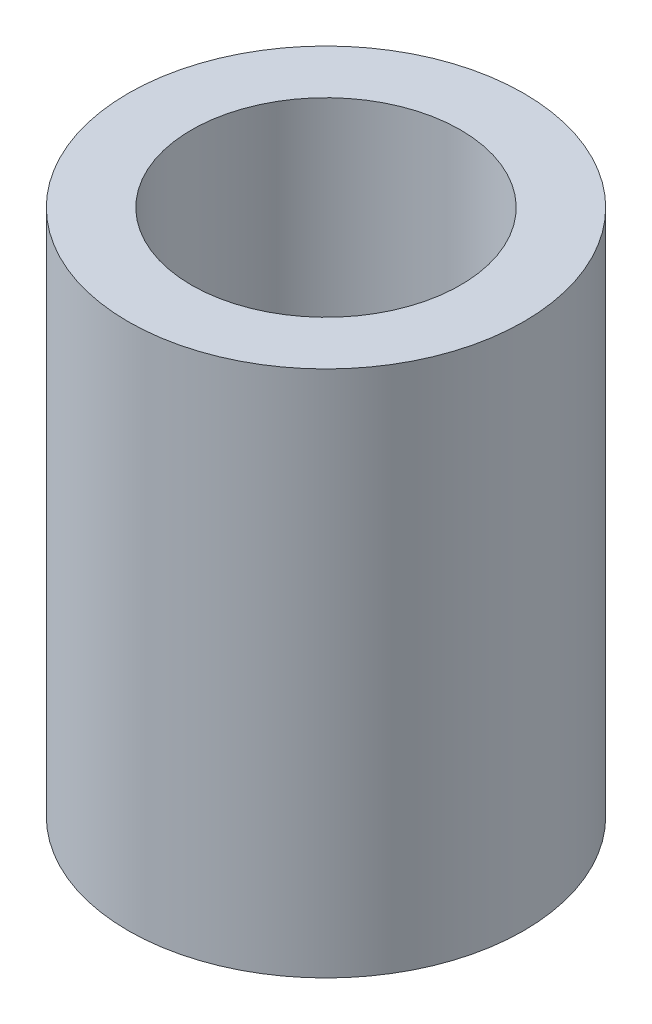
ISO-10303-21;
HEADER;
FILE_DESCRIPTION(('STEP AP214'),'2;1');
FILE_NAME('part.step','',(''),(''),'','','');
FILE_SCHEMA(('AUTOMOTIVE_DESIGN { 1 0 10303 214 1 1 1 1 }'));
ENDSEC;
DATA;
#1=APPLICATION_CONTEXT('core data for automotive mechanical design processes');
#2=APPLICATION_PROTOCOL_DEFINITION('international standard','automotive_design',2000,#1);
#3=PRODUCT_CONTEXT('',#1,'mechanical');
#4=PRODUCT('Part','Part','',(#3));
#5=PRODUCT_RELATED_PRODUCT_CATEGORY('part','',(#4));
#6=PRODUCT_DEFINITION_FORMATION('','',#4);
#7=PRODUCT_DEFINITION_CONTEXT('part definition',#1,'design');
#8=PRODUCT_DEFINITION('design','',#6,#7);
#9=PRODUCT_DEFINITION_SHAPE('','',#8);
#10=(LENGTH_UNIT() NAMED_UNIT(*) SI_UNIT(.MILLI.,.METRE.));
#11=(NAMED_UNIT(*) PLANE_ANGLE_UNIT() SI_UNIT($,.RADIAN.));
#12=(NAMED_UNIT(*) SI_UNIT($,.STERADIAN.) SOLID_ANGLE_UNIT());
#13=UNCERTAINTY_MEASURE_WITH_UNIT(LENGTH_MEASURE(1.E-05),#10,'distance_accuracy_value','');
#14=(GEOMETRIC_REPRESENTATION_CONTEXT(3) GLOBAL_UNCERTAINTY_ASSIGNED_CONTEXT((#13)) GLOBAL_UNIT_ASSIGNED_CONTEXT((#10,
#11,#12)) REPRESENTATION_CONTEXT('',''));
#15=CARTESIAN_POINT('',(0.,0.,0.));
#16=DIRECTION('',(0.,0.,1.));
#17=DIRECTION('',(1.,0.,0.));
#18=AXIS2_PLACEMENT_3D('',#15,#16,#17);
#19=CARTESIAN_POINT('',(0.,6.35,0.));
#20=DIRECTION('',(0.,1.,0.));
#21=DIRECTION('',(0.,0.,1.));
#22=AXIS2_PLACEMENT_3D('',#19,#20,#21);
#23=PLANE('',#22);
#24=CARTESIAN_POINT('',(0.,6.35,0.));
#25=DIRECTION('',(0.,1.,0.));
#26=DIRECTION('',(0.,0.,1.));
#27=AXIS2_PLACEMENT_3D('',#24,#25,#26);
#28=CIRCLE('',#27,4.7625);
#29=CARTESIAN_POINT('',(0.,6.35,4.7625));
#30=VERTEX_POINT('',#29);
#31=EDGE_CURVE('E10',#30,#30,#28,.T.);
#32=ORIENTED_EDGE('',*,*,#31,.T.);
#33=EDGE_LOOP('',(#32));
#34=FACE_BOUND('',#33,.T.);
#35=CARTESIAN_POINT('',(0.,6.35,0.));
#36=DIRECTION('',(0.,1.,0.));
#37=DIRECTION('',(0.,0.,1.));
#38=AXIS2_PLACEMENT_3D('',#35,#36,#37);
#39=CIRCLE('',#38,3.2385);
#40=CARTESIAN_POINT('',(0.,6.35,3.2385));
#41=VERTEX_POINT('',#40);
#42=EDGE_CURVE('E46',#41,#41,#39,.T.);
#43=ORIENTED_EDGE('',*,*,#42,.F.);
#44=EDGE_LOOP('',(#43));
#45=FACE_BOUND('',#44,.T.);
#46=ADVANCED_FACE('F35',(#34,#45),#23,.T.);
#47=CARTESIAN_POINT('',(0.,-6.35,0.));
#48=DIRECTION('',(0.,1.,0.));
#49=DIRECTION('',(0.,0.,1.));
#50=AXIS2_PLACEMENT_3D('',#47,#48,#49);
#51=PLANE('',#50);
#52=CARTESIAN_POINT('',(0.,-6.35,0.));
#53=DIRECTION('',(0.,1.,0.));
#54=DIRECTION('',(0.,0.,1.));
#55=AXIS2_PLACEMENT_3D('',#52,#53,#54);
#56=CIRCLE('',#55,4.7625);
#57=CARTESIAN_POINT('',(0.,-6.35,4.7625));
#58=VERTEX_POINT('',#57);
#59=EDGE_CURVE('E39',#58,#58,#56,.T.);
#60=ORIENTED_EDGE('',*,*,#59,.F.);
#61=EDGE_LOOP('',(#60));
#62=FACE_BOUND('',#61,.T.);
#63=CARTESIAN_POINT('',(0.,-6.35,0.));
#64=DIRECTION('',(0.,1.,0.));
#65=DIRECTION('',(0.,0.,1.));
#66=AXIS2_PLACEMENT_3D('',#63,#64,#65);
#67=CIRCLE('',#66,3.2385);
#68=CARTESIAN_POINT('',(0.,-6.35,3.2385));
#69=VERTEX_POINT('',#68);
#70=EDGE_CURVE('E48',#69,#69,#67,.T.);
#71=ORIENTED_EDGE('',*,*,#70,.T.);
#72=EDGE_LOOP('',(#71));
#73=FACE_BOUND('',#72,.T.);
#74=ADVANCED_FACE('F58',(#62,#73),#51,.F.);
#75=CARTESIAN_POINT('',(0.,6.35,0.));
#76=DIRECTION('',(0.,-1.,0.));
#77=DIRECTION('',(0.,0.,-1.));
#78=AXIS2_PLACEMENT_3D('',#75,#76,#77);
#79=CYLINDRICAL_SURFACE('',#78,4.7625);
#80=ORIENTED_EDGE('',*,*,#31,.F.);
#81=EDGE_LOOP('',(#80));
#82=FACE_BOUND('',#81,.T.);
#83=ORIENTED_EDGE('',*,*,#59,.T.);
#84=EDGE_LOOP('',(#83));
#85=FACE_BOUND('',#84,.T.);
#86=ADVANCED_FACE('F37',(#82,#85),#79,.T.);
#87=CARTESIAN_POINT('',(0.,6.35,0.));
#88=DIRECTION('',(0.,-1.,0.));
#89=DIRECTION('',(0.,0.,-1.));
#90=AXIS2_PLACEMENT_3D('',#87,#88,#89);
#91=CYLINDRICAL_SURFACE('',#90,3.2385);
#92=ORIENTED_EDGE('',*,*,#42,.T.);
#93=EDGE_LOOP('',(#92));
#94=FACE_BOUND('',#93,.T.);
#95=ORIENTED_EDGE('',*,*,#70,.F.);
#96=EDGE_LOOP('',(#95));
#97=FACE_BOUND('',#96,.T.);
#98=ADVANCED_FACE('F54',(#94,#97),#91,.F.);
#99=CLOSED_SHELL('',(#46,#74,#86,#98));
#100=MANIFOLD_SOLID_BREP('B2',#99);
#101=ADVANCED_BREP_SHAPE_REPRESENTATION('',(#18,#100),#14);
#102=SHAPE_DEFINITION_REPRESENTATION(#9,#101);
ENDSEC;
END-ISO-10303-21;
